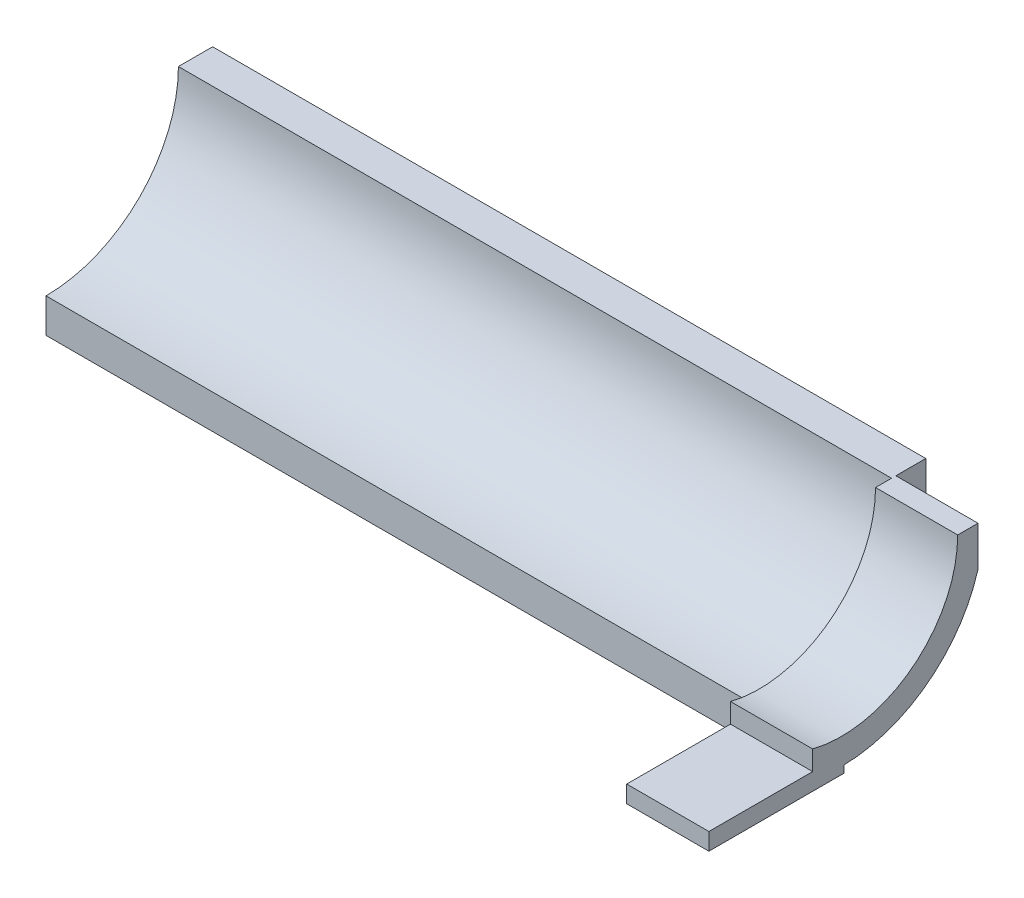
ISO-10303-21;
HEADER;
FILE_DESCRIPTION(('STEP AP214'),'2;1');
FILE_NAME('part.step','',(''),(''),'','','');
FILE_SCHEMA(('AUTOMOTIVE_DESIGN { 1 0 10303 214 1 1 1 1 }'));
ENDSEC;
DATA;
#1=APPLICATION_CONTEXT('core data for automotive mechanical design processes');
#2=APPLICATION_PROTOCOL_DEFINITION('international standard','automotive_design',2000,#1);
#3=PRODUCT_CONTEXT('',#1,'mechanical');
#4=PRODUCT('Part','Part','',(#3));
#5=PRODUCT_RELATED_PRODUCT_CATEGORY('part','',(#4));
#6=PRODUCT_DEFINITION_FORMATION('','',#4);
#7=PRODUCT_DEFINITION_CONTEXT('part definition',#1,'design');
#8=PRODUCT_DEFINITION('design','',#6,#7);
#9=PRODUCT_DEFINITION_SHAPE('','',#8);
#10=(LENGTH_UNIT() NAMED_UNIT(*) SI_UNIT(.MILLI.,.METRE.));
#11=(NAMED_UNIT(*) PLANE_ANGLE_UNIT() SI_UNIT($,.RADIAN.));
#12=(NAMED_UNIT(*) SI_UNIT($,.STERADIAN.) SOLID_ANGLE_UNIT());
#13=UNCERTAINTY_MEASURE_WITH_UNIT(LENGTH_MEASURE(1.E-05),#10,'distance_accuracy_value','');
#14=(GEOMETRIC_REPRESENTATION_CONTEXT(3) GLOBAL_UNCERTAINTY_ASSIGNED_CONTEXT((#13)) GLOBAL_UNIT_ASSIGNED_CONTEXT((#10,
#11,#12)) REPRESENTATION_CONTEXT('',''));
#15=CARTESIAN_POINT('',(0.,0.,0.));
#16=DIRECTION('',(0.,0.,1.));
#17=DIRECTION('',(1.,0.,0.));
#18=AXIS2_PLACEMENT_3D('',#15,#16,#17);
#19=CARTESIAN_POINT('',(66.1416,10.3365691560055,-21.9265015545331));
#20=DIRECTION('',(1.,0.,0.));
#21=DIRECTION('',(0.,0.,-1.));
#22=AXIS2_PLACEMENT_3D('',#19,#20,#21);
#23=PLANE('',#22);
#24=DIRECTION('',(0.,1.,0.));
#25=VECTOR('',#24,1.);
#26=CARTESIAN_POINT('',(66.1416,-3.53183084399447,-22.1989793496736));
#27=LINE('',#26,#25);
#28=CARTESIAN_POINT('',(66.1416,-3.53183084399447,-22.1989793496736));
#29=VERTEX_POINT('',#28);
#30=CARTESIAN_POINT('',(66.1416,-2.86861996990839,-22.1989793496736));
#31=VERTEX_POINT('',#30);
#32=EDGE_CURVE('E109',#29,#31,#27,.T.);
#33=ORIENTED_EDGE('',*,*,#32,.F.);
#34=DIRECTION('',(0.,0.,1.));
#35=VECTOR('',#34,1.);
#36=CARTESIAN_POINT('',(66.1416,-3.53183084399447,0.));
#37=LINE('',#36,#35);
#38=CARTESIAN_POINT('',(66.1416,-3.53183084399447,-21.9265015545331));
#39=VERTEX_POINT('',#38);
#40=EDGE_CURVE('E223',#29,#39,#37,.T.);
#41=ORIENTED_EDGE('',*,*,#40,.T.);
#42=DIRECTION('',(0.,-1.,0.));
#43=VECTOR('',#42,1.);
#44=CARTESIAN_POINT('',(66.1416,-5.11933084399447,-21.9265015545331));
#45=LINE('',#44,#43);
#46=CARTESIAN_POINT('',(66.1416,-5.11933084399447,-21.9265015545331));
#47=VERTEX_POINT('',#46);
#48=EDGE_CURVE('E279',#39,#47,#45,.T.);
#49=ORIENTED_EDGE('',*,*,#48,.T.);
#50=DIRECTION('',(0.,0.,-1.));
#51=VECTOR('',#50,1.);
#52=CARTESIAN_POINT('',(66.1416,-5.11933084399447,-37.3824015545331));
#53=LINE('',#52,#51);
#54=CARTESIAN_POINT('',(66.1416,-5.11933084399447,-37.3824015545331));
#55=VERTEX_POINT('',#54);
#56=EDGE_CURVE('E284',#47,#55,#53,.T.);
#57=ORIENTED_EDGE('',*,*,#56,.T.);
#58=DIRECTION('',(0.,1.,0.));
#59=VECTOR('',#58,1.);
#60=CARTESIAN_POINT('',(66.1416,10.3365691560055,-37.3824015545331));
#61=LINE('',#60,#59);
#62=CARTESIAN_POINT('',(66.1416,10.3365691560055,-37.3824015545331));
#63=VERTEX_POINT('',#62);
#64=EDGE_CURVE('E286',#55,#63,#61,.T.);
#65=ORIENTED_EDGE('',*,*,#64,.T.);
#66=DIRECTION('',(0.,0.,1.));
#67=VECTOR('',#66,1.);
#68=CARTESIAN_POINT('',(66.1416,10.3365691560055,-34.2074015545331));
#69=LINE('',#68,#67);
#70=CARTESIAN_POINT('',(66.1416,10.3365691560055,-34.6048765545184));
#71=VERTEX_POINT('',#70);
#72=EDGE_CURVE('E288',#63,#71,#69,.T.);
#73=ORIENTED_EDGE('',*,*,#72,.T.);
#74=DIRECTION('',(0.,-1.,0.));
#75=VECTOR('',#74,1.);
#76=CARTESIAN_POINT('',(66.1416,10.3365691560055,-34.6048765545184));
#77=LINE('',#76,#75);
#78=CARTESIAN_POINT('',(66.1416,6.63385780353041,-34.6048765545184));
#79=VERTEX_POINT('',#78);
#80=EDGE_CURVE('E262',#71,#79,#77,.T.);
#81=ORIENTED_EDGE('',*,*,#80,.T.);
#82=CARTESIAN_POINT('',(66.1416,10.3365691560055,-21.9265015545331));
#83=DIRECTION('',(1.,0.,0.));
#84=DIRECTION('',(0.,0.,-1.));
#85=AXIS2_PLACEMENT_3D('',#82,#83,#84);
#86=CIRCLE('',#85,13.208);
#87=EDGE_CURVE('E114',#31,#79,#86,.T.);
#88=ORIENTED_EDGE('',*,*,#87,.F.);
#89=EDGE_LOOP('',(#33,#41,#49,#57,#65,#73,#81,#88));
#90=FACE_BOUND('',#89,.T.);
#91=ADVANCED_FACE('F94',(#90),#23,.T.);
#92=CARTESIAN_POINT('',(66.1416,10.3365691560055,-21.9265015545331));
#93=DIRECTION('',(-1.,0.,0.));
#94=DIRECTION('',(0.,0.,1.));
#95=AXIS2_PLACEMENT_3D('',#92,#93,#94);
#96=CYLINDRICAL_SURFACE('',#95,12.2809);
#97=CARTESIAN_POINT('',(0.,10.3365691560055,-21.9265015545331));
#98=DIRECTION('',(-1.,0.,0.));
#99=DIRECTION('',(0.,0.,-1.));
#100=AXIS2_PLACEMENT_3D('',#97,#98,#99);
#101=CIRCLE('',#100,12.2809);
#102=CARTESIAN_POINT('',(0.,10.3365691560055,-34.2074015545331));
#103=VERTEX_POINT('',#102);
#104=CARTESIAN_POINT('',(0.,-1.94433084399446,-21.9265015545331));
#105=VERTEX_POINT('',#104);
#106=EDGE_CURVE('E206',#103,#105,#101,.T.);
#107=ORIENTED_EDGE('',*,*,#106,.T.);
#108=DIRECTION('',(-1.,0.,0.));
#109=VECTOR('',#108,1.);
#110=CARTESIAN_POINT('',(66.1416,-1.94433084399446,-21.9265015545331));
#111=LINE('',#110,#109);
#112=CARTESIAN_POINT('',(66.1416,-1.94433084399446,-21.9265015545331));
#113=VERTEX_POINT('',#112);
#114=EDGE_CURVE('E12',#113,#105,#111,.T.);
#115=ORIENTED_EDGE('',*,*,#114,.F.);
#116=CARTESIAN_POINT('',(66.1416,10.3365691560055,-21.9265015545331));
#117=DIRECTION('',(-1.,0.,0.));
#118=DIRECTION('',(0.,0.,-1.));
#119=AXIS2_PLACEMENT_3D('',#116,#117,#118);
#120=CIRCLE('',#119,12.2809);
#121=CARTESIAN_POINT('',(66.1416,10.3365691560055,-34.2074015545331));
#122=VERTEX_POINT('',#121);
#123=EDGE_CURVE('E276',#122,#113,#120,.T.);
#124=ORIENTED_EDGE('',*,*,#123,.F.);
#125=DIRECTION('',(-1.,0.,0.));
#126=VECTOR('',#125,1.);
#127=CARTESIAN_POINT('',(66.1416,10.3365691560055,-34.2074015545331));
#128=LINE('',#127,#126);
#129=EDGE_CURVE('E290',#122,#103,#128,.T.);
#130=ORIENTED_EDGE('',*,*,#129,.T.);
#131=EDGE_LOOP('',(#107,#115,#124,#130));
#132=FACE_BOUND('',#131,.T.);
#133=ADVANCED_FACE('F96',(#132),#96,.F.);
#134=CARTESIAN_POINT('',(66.1416,-5.11933084399447,-21.9265015545331));
#135=DIRECTION('',(0.,0.,-1.));
#136=DIRECTION('',(0.,1.,0.));
#137=AXIS2_PLACEMENT_3D('',#134,#135,#136);
#138=PLANE('',#137);
#139=DIRECTION('',(0.,-1.,0.));
#140=VECTOR('',#139,1.);
#141=CARTESIAN_POINT('',(0.,-5.11933084399447,-21.9265015545331));
#142=LINE('',#141,#140);
#143=CARTESIAN_POINT('',(0.,-5.11933084399447,-21.9265015545331));
#144=VERTEX_POINT('',#143);
#145=EDGE_CURVE('E293',#105,#144,#142,.T.);
#146=ORIENTED_EDGE('',*,*,#145,.T.);
#147=DIRECTION('',(-1.,0.,0.));
#148=VECTOR('',#147,1.);
#149=CARTESIAN_POINT('',(66.1416,-5.11933084399447,-21.9265015545331));
#150=LINE('',#149,#148);
#151=EDGE_CURVE('E102',#47,#144,#150,.T.);
#152=ORIENTED_EDGE('',*,*,#151,.F.);
#153=ORIENTED_EDGE('',*,*,#48,.F.);
#154=EDGE_CURVE('E281',#113,#39,#45,.T.);
#155=ORIENTED_EDGE('',*,*,#154,.F.);
#156=ORIENTED_EDGE('',*,*,#114,.T.);
#157=EDGE_LOOP('',(#146,#152,#153,#155,#156));
#158=FACE_BOUND('',#157,.T.);
#159=ADVANCED_FACE('F330',(#158),#138,.F.);
#160=CARTESIAN_POINT('',(66.1416,-5.11933084399447,-37.3824015545331));
#161=DIRECTION('',(0.,1.,0.));
#162=DIRECTION('',(0.,0.,1.));
#163=AXIS2_PLACEMENT_3D('',#160,#161,#162);
#164=PLANE('',#163);
#165=DIRECTION('',(0.,0.,-1.));
#166=VECTOR('',#165,1.);
#167=CARTESIAN_POINT('',(0.,-5.11933084399447,-37.3824015545331));
#168=LINE('',#167,#166);
#169=CARTESIAN_POINT('',(0.,-5.11933084399447,-37.3824015545331));
#170=VERTEX_POINT('',#169);
#171=EDGE_CURVE('E295',#144,#170,#168,.T.);
#172=ORIENTED_EDGE('',*,*,#171,.T.);
#173=DIRECTION('',(-1.,0.,0.));
#174=VECTOR('',#173,1.);
#175=CARTESIAN_POINT('',(66.1416,-5.11933084399447,-37.3824015545331));
#176=LINE('',#175,#174);
#177=EDGE_CURVE('E305',#55,#170,#176,.T.);
#178=ORIENTED_EDGE('',*,*,#177,.F.);
#179=ORIENTED_EDGE('',*,*,#56,.F.);
#180=ORIENTED_EDGE('',*,*,#151,.T.);
#181=EDGE_LOOP('',(#172,#178,#179,#180));
#182=FACE_BOUND('',#181,.T.);
#183=ADVANCED_FACE('F312',(#182),#164,.F.);
#184=CARTESIAN_POINT('',(66.1416,10.3365691560055,-37.3824015545331));
#185=DIRECTION('',(0.,0.,1.));
#186=DIRECTION('',(1.,0.,0.));
#187=AXIS2_PLACEMENT_3D('',#184,#185,#186);
#188=PLANE('',#187);
#189=DIRECTION('',(0.,1.,0.));
#190=VECTOR('',#189,1.);
#191=CARTESIAN_POINT('',(0.,10.3365691560055,-37.3824015545331));
#192=LINE('',#191,#190);
#193=CARTESIAN_POINT('',(0.,10.3365691560055,-37.3824015545331));
#194=VERTEX_POINT('',#193);
#195=EDGE_CURVE('E297',#170,#194,#192,.T.);
#196=ORIENTED_EDGE('',*,*,#195,.T.);
#197=DIRECTION('',(-1.,0.,0.));
#198=VECTOR('',#197,1.);
#199=CARTESIAN_POINT('',(66.1416,10.3365691560055,-37.3824015545331));
#200=LINE('',#199,#198);
#201=EDGE_CURVE('E302',#63,#194,#200,.T.);
#202=ORIENTED_EDGE('',*,*,#201,.F.);
#203=ORIENTED_EDGE('',*,*,#64,.F.);
#204=ORIENTED_EDGE('',*,*,#177,.T.);
#205=EDGE_LOOP('',(#196,#202,#203,#204));
#206=FACE_BOUND('',#205,.T.);
#207=ADVANCED_FACE('F323',(#206),#188,.F.);
#208=CARTESIAN_POINT('',(66.1416,10.3365691560055,-34.2074015545331));
#209=DIRECTION('',(0.,-1.,0.));
#210=DIRECTION('',(0.,0.,-1.));
#211=AXIS2_PLACEMENT_3D('',#208,#209,#210);
#212=PLANE('',#211);
#213=DIRECTION('',(0.,0.,1.));
#214=VECTOR('',#213,1.);
#215=CARTESIAN_POINT('',(0.,10.3365691560055,-34.2074015545331));
#216=LINE('',#215,#214);
#217=EDGE_CURVE('E280',#194,#103,#216,.T.);
#218=ORIENTED_EDGE('',*,*,#217,.T.);
#219=ORIENTED_EDGE('',*,*,#129,.F.);
#220=DIRECTION('',(0.,0.,-1.));
#221=VECTOR('',#220,1.);
#222=CARTESIAN_POINT('',(66.1416,10.3365691560055,0.));
#223=LINE('',#222,#221);
#224=CARTESIAN_POINT('',(66.1416,10.3365691560055,-32.7215015545331));
#225=VERTEX_POINT('',#224);
#226=EDGE_CURVE('E220',#225,#122,#223,.T.);
#227=ORIENTED_EDGE('',*,*,#226,.F.);
#228=DIRECTION('',(-1.,0.,0.));
#229=VECTOR('',#228,1.);
#230=CARTESIAN_POINT('',(73.7616,10.3365691560055,-32.7215015545331));
#231=LINE('',#230,#229);
#232=CARTESIAN_POINT('',(73.7616,10.3365691560055,-32.7215015545331));
#233=VERTEX_POINT('',#232);
#234=EDGE_CURVE('E234',#233,#225,#231,.T.);
#235=ORIENTED_EDGE('',*,*,#234,.F.);
#236=DIRECTION('',(0.,0.,-1.));
#237=VECTOR('',#236,1.);
#238=CARTESIAN_POINT('',(73.7616,10.3365691560055,0.));
#239=LINE('',#238,#237);
#240=CARTESIAN_POINT('',(73.7616,10.3365691560055,-34.6048765545184));
#241=VERTEX_POINT('',#240);
#242=EDGE_CURVE('E219',#233,#241,#239,.T.);
#243=ORIENTED_EDGE('',*,*,#242,.T.);
#244=DIRECTION('',(-1.,0.,0.));
#245=VECTOR('',#244,1.);
#246=CARTESIAN_POINT('',(73.7616,10.3365691560055,-34.6048765545184));
#247=LINE('',#246,#245);
#248=EDGE_CURVE('E261',#241,#71,#247,.T.);
#249=ORIENTED_EDGE('',*,*,#248,.T.);
#250=ORIENTED_EDGE('',*,*,#72,.F.);
#251=ORIENTED_EDGE('',*,*,#201,.T.);
#252=EDGE_LOOP('',(#218,#219,#227,#235,#243,#249,#250,#251));
#253=FACE_BOUND('',#252,.T.);
#254=ADVANCED_FACE('F327',(#253),#212,.F.);
#255=CARTESIAN_POINT('',(0.,10.3365691560055,-21.9265015545331));
#256=DIRECTION('',(1.,0.,0.));
#257=DIRECTION('',(0.,0.,-1.));
#258=AXIS2_PLACEMENT_3D('',#255,#256,#257);
#259=PLANE('',#258);
#260=ORIENTED_EDGE('',*,*,#106,.F.);
#261=ORIENTED_EDGE('',*,*,#217,.F.);
#262=ORIENTED_EDGE('',*,*,#195,.F.);
#263=ORIENTED_EDGE('',*,*,#171,.F.);
#264=ORIENTED_EDGE('',*,*,#145,.F.);
#265=EDGE_LOOP('',(#260,#261,#262,#263,#264));
#266=FACE_BOUND('',#265,.T.);
#267=ADVANCED_FACE('F319',(#266),#259,.F.);
#268=CARTESIAN_POINT('',(66.1416,0.,0.));
#269=DIRECTION('',(1.,0.,0.));
#270=DIRECTION('',(0.,0.,-1.));
#271=AXIS2_PLACEMENT_3D('',#268,#269,#270);
#272=PLANE('',#271);
#273=ORIENTED_EDGE('',*,*,#226,.T.);
#274=ORIENTED_EDGE('',*,*,#123,.T.);
#275=ORIENTED_EDGE('',*,*,#154,.T.);
#276=CARTESIAN_POINT('',(66.1416,-3.53183084399447,-9.6464015545331));
#277=VERTEX_POINT('',#276);
#278=EDGE_CURVE('E245',#39,#277,#37,.T.);
#279=ORIENTED_EDGE('',*,*,#278,.T.);
#280=DIRECTION('',(0.,1.,0.));
#281=VECTOR('',#280,1.);
#282=CARTESIAN_POINT('',(66.1416,0.,-9.6464015545331));
#283=LINE('',#282,#281);
#284=CARTESIAN_POINT('',(66.1416,-1.94433084399447,-9.6464015545331));
#285=VERTEX_POINT('',#284);
#286=EDGE_CURVE('E242',#277,#285,#283,.T.);
#287=ORIENTED_EDGE('',*,*,#286,.T.);
#288=DIRECTION('',(0.,0.,1.));
#289=VECTOR('',#288,1.);
#290=CARTESIAN_POINT('',(66.1416,-1.94433084399447,0.));
#291=LINE('',#290,#289);
#292=CARTESIAN_POINT('',(66.1416,-1.94433084399447,-19.268287123951));
#293=VERTEX_POINT('',#292);
#294=EDGE_CURVE('E239',#293,#285,#291,.T.);
#295=ORIENTED_EDGE('',*,*,#294,.F.);
#296=DIRECTION('',(0.,-1.,0.));
#297=VECTOR('',#296,1.);
#298=CARTESIAN_POINT('',(66.1416,0.,-19.268287123951));
#299=LINE('',#298,#297);
#300=CARTESIAN_POINT('',(66.1416,-0.126027129861796,-19.268287123951));
#301=VERTEX_POINT('',#300);
#302=EDGE_CURVE('E236',#301,#293,#299,.T.);
#303=ORIENTED_EDGE('',*,*,#302,.F.);
#304=CARTESIAN_POINT('',(66.1416,10.3365691560055,-21.9265015545331));
#305=DIRECTION('',(1.,0.,0.));
#306=DIRECTION('',(0.,0.,-1.));
#307=AXIS2_PLACEMENT_3D('',#304,#305,#306);
#308=CIRCLE('',#307,10.795);
#309=EDGE_CURVE('E203',#301,#225,#308,.T.);
#310=ORIENTED_EDGE('',*,*,#309,.T.);
#311=EDGE_LOOP('',(#273,#274,#275,#279,#287,#295,#303,#310));
#312=FACE_BOUND('',#311,.T.);
#313=ADVANCED_FACE('F334',(#312),#272,.F.);
#314=CARTESIAN_POINT('',(73.7616,-3.53183084399447,0.));
#315=DIRECTION('',(0.,-1.,0.));
#316=DIRECTION('',(0.,0.,-1.));
#317=AXIS2_PLACEMENT_3D('',#314,#315,#316);
#318=PLANE('',#317);
#319=ORIENTED_EDGE('',*,*,#40,.F.);
#320=DIRECTION('',(-1.,0.,0.));
#321=VECTOR('',#320,1.);
#322=CARTESIAN_POINT('',(73.7616,-3.53183084399447,-22.1989793496736));
#323=LINE('',#322,#321);
#324=CARTESIAN_POINT('',(73.7616,-3.53183084399447,-22.1989793496736));
#325=VERTEX_POINT('',#324);
#326=EDGE_CURVE('E237',#325,#29,#323,.T.);
#327=ORIENTED_EDGE('',*,*,#326,.F.);
#328=DIRECTION('',(0.,0.,1.));
#329=VECTOR('',#328,1.);
#330=CARTESIAN_POINT('',(73.7616,-3.53183084399447,0.));
#331=LINE('',#330,#329);
#332=CARTESIAN_POINT('',(73.7616,-3.53183084399447,-9.6464015545331));
#333=VERTEX_POINT('',#332);
#334=EDGE_CURVE('E230',#325,#333,#331,.T.);
#335=ORIENTED_EDGE('',*,*,#334,.T.);
#336=DIRECTION('',(-1.,0.,0.));
#337=VECTOR('',#336,1.);
#338=CARTESIAN_POINT('',(73.7616,-3.53183084399447,-9.6464015545331));
#339=LINE('',#338,#337);
#340=EDGE_CURVE('E248',#333,#277,#339,.T.);
#341=ORIENTED_EDGE('',*,*,#340,.T.);
#342=ORIENTED_EDGE('',*,*,#278,.F.);
#343=EDGE_LOOP('',(#319,#327,#335,#341,#342));
#344=FACE_BOUND('',#343,.T.);
#345=ADVANCED_FACE('F337',(#344),#318,.T.);
#346=CARTESIAN_POINT('',(73.7616,0.,-9.6464015545331));
#347=DIRECTION('',(0.,0.,1.));
#348=DIRECTION('',(1.,0.,0.));
#349=AXIS2_PLACEMENT_3D('',#346,#347,#348);
#350=PLANE('',#349);
#351=ORIENTED_EDGE('',*,*,#286,.F.);
#352=ORIENTED_EDGE('',*,*,#340,.F.);
#353=DIRECTION('',(0.,1.,0.));
#354=VECTOR('',#353,1.);
#355=CARTESIAN_POINT('',(73.7616,0.,-9.6464015545331));
#356=LINE('',#355,#354);
#357=CARTESIAN_POINT('',(73.7616,-1.94433084399447,-9.6464015545331));
#358=VERTEX_POINT('',#357);
#359=EDGE_CURVE('E227',#333,#358,#356,.T.);
#360=ORIENTED_EDGE('',*,*,#359,.T.);
#361=DIRECTION('',(-1.,0.,0.));
#362=VECTOR('',#361,1.);
#363=CARTESIAN_POINT('',(73.7616,-1.94433084399447,-9.6464015545331));
#364=LINE('',#363,#362);
#365=EDGE_CURVE('E251',#358,#285,#364,.T.);
#366=ORIENTED_EDGE('',*,*,#365,.T.);
#367=EDGE_LOOP('',(#351,#352,#360,#366));
#368=FACE_BOUND('',#367,.T.);
#369=ADVANCED_FACE('F342',(#368),#350,.T.);
#370=CARTESIAN_POINT('',(73.7616,-1.94433084399447,0.));
#371=DIRECTION('',(0.,-1.,0.));
#372=DIRECTION('',(0.,0.,-1.));
#373=AXIS2_PLACEMENT_3D('',#370,#371,#372);
#374=PLANE('',#373);
#375=ORIENTED_EDGE('',*,*,#294,.T.);
#376=ORIENTED_EDGE('',*,*,#365,.F.);
#377=DIRECTION('',(0.,0.,1.));
#378=VECTOR('',#377,1.);
#379=CARTESIAN_POINT('',(73.7616,-1.94433084399447,0.));
#380=LINE('',#379,#378);
#381=CARTESIAN_POINT('',(73.7616,-1.94433084399447,-19.268287123951));
#382=VERTEX_POINT('',#381);
#383=EDGE_CURVE('E215',#382,#358,#380,.T.);
#384=ORIENTED_EDGE('',*,*,#383,.F.);
#385=DIRECTION('',(-1.,0.,0.));
#386=VECTOR('',#385,1.);
#387=CARTESIAN_POINT('',(73.7616,-1.94433084399447,-19.268287123951));
#388=LINE('',#387,#386);
#389=EDGE_CURVE('E207',#382,#293,#388,.T.);
#390=ORIENTED_EDGE('',*,*,#389,.T.);
#391=EDGE_LOOP('',(#375,#376,#384,#390));
#392=FACE_BOUND('',#391,.T.);
#393=ADVANCED_FACE('F346',(#392),#374,.F.);
#394=CARTESIAN_POINT('',(73.7616,0.,-19.268287123951));
#395=DIRECTION('',(0.,0.,-1.));
#396=DIRECTION('',(-1.,0.,0.));
#397=AXIS2_PLACEMENT_3D('',#394,#395,#396);
#398=PLANE('',#397);
#399=ORIENTED_EDGE('',*,*,#302,.T.);
#400=ORIENTED_EDGE('',*,*,#389,.F.);
#401=DIRECTION('',(0.,-1.,0.));
#402=VECTOR('',#401,1.);
#403=CARTESIAN_POINT('',(73.7616,0.,-19.268287123951));
#404=LINE('',#403,#402);
#405=CARTESIAN_POINT('',(73.7616,-0.126027129861796,-19.268287123951));
#406=VERTEX_POINT('',#405);
#407=EDGE_CURVE('E210',#406,#382,#404,.T.);
#408=ORIENTED_EDGE('',*,*,#407,.F.);
#409=DIRECTION('',(-1.,0.,0.));
#410=VECTOR('',#409,1.);
#411=CARTESIAN_POINT('',(73.7616,-0.126027129861796,-19.268287123951));
#412=LINE('',#411,#410);
#413=EDGE_CURVE('E196',#406,#301,#412,.T.);
#414=ORIENTED_EDGE('',*,*,#413,.T.);
#415=EDGE_LOOP('',(#399,#400,#408,#414));
#416=FACE_BOUND('',#415,.T.);
#417=ADVANCED_FACE('F211',(#416),#398,.F.);
#418=CARTESIAN_POINT('',(73.7616,10.3365691560055,-21.9265015545331));
#419=DIRECTION('',(-1.,0.,0.));
#420=DIRECTION('',(0.,0.,1.));
#421=AXIS2_PLACEMENT_3D('',#418,#419,#420);
#422=CYLINDRICAL_SURFACE('',#421,10.795);
#423=ORIENTED_EDGE('',*,*,#309,.F.);
#424=ORIENTED_EDGE('',*,*,#413,.F.);
#425=CARTESIAN_POINT('',(73.7616,10.3365691560055,-21.9265015545331));
#426=DIRECTION('',(1.,0.,0.));
#427=DIRECTION('',(0.,0.,-1.));
#428=AXIS2_PLACEMENT_3D('',#425,#426,#427);
#429=CIRCLE('',#428,10.795);
#430=EDGE_CURVE('E200',#406,#233,#429,.T.);
#431=ORIENTED_EDGE('',*,*,#430,.T.);
#432=ORIENTED_EDGE('',*,*,#234,.T.);
#433=EDGE_LOOP('',(#423,#424,#431,#432));
#434=FACE_BOUND('',#433,.T.);
#435=ADVANCED_FACE('F198',(#434),#422,.F.);
#436=CARTESIAN_POINT('',(73.7616,0.,0.));
#437=DIRECTION('',(1.,0.,0.));
#438=DIRECTION('',(0.,0.,-1.));
#439=AXIS2_PLACEMENT_3D('',#436,#437,#438);
#440=PLANE('',#439);
#441=ORIENTED_EDGE('',*,*,#334,.F.);
#442=DIRECTION('',(0.,1.,0.));
#443=VECTOR('',#442,1.);
#444=CARTESIAN_POINT('',(73.7616,-3.53183084399447,-22.1989793496736));
#445=LINE('',#444,#443);
#446=CARTESIAN_POINT('',(73.7616,-2.86861996990839,-22.1989793496736));
#447=VERTEX_POINT('',#446);
#448=EDGE_CURVE('E259',#325,#447,#445,.T.);
#449=ORIENTED_EDGE('',*,*,#448,.T.);
#450=CARTESIAN_POINT('',(73.7616,10.3365691560055,-21.9265015545331));
#451=DIRECTION('',(1.,0.,0.));
#452=DIRECTION('',(0.,0.,-1.));
#453=AXIS2_PLACEMENT_3D('',#450,#451,#452);
#454=CIRCLE('',#453,13.208);
#455=CARTESIAN_POINT('',(73.7616,6.63385780353041,-34.6048765545184));
#456=VERTEX_POINT('',#455);
#457=EDGE_CURVE('E257',#447,#456,#454,.T.);
#458=ORIENTED_EDGE('',*,*,#457,.T.);
#459=DIRECTION('',(0.,-1.,0.));
#460=VECTOR('',#459,1.);
#461=CARTESIAN_POINT('',(73.7616,10.3365691560055,-34.6048765545184));
#462=LINE('',#461,#460);
#463=EDGE_CURVE('E254',#241,#456,#462,.T.);
#464=ORIENTED_EDGE('',*,*,#463,.F.);
#465=ORIENTED_EDGE('',*,*,#242,.F.);
#466=ORIENTED_EDGE('',*,*,#430,.F.);
#467=ORIENTED_EDGE('',*,*,#407,.T.);
#468=ORIENTED_EDGE('',*,*,#383,.T.);
#469=ORIENTED_EDGE('',*,*,#359,.F.);
#470=EDGE_LOOP('',(#441,#449,#458,#464,#465,#466,#467,#468,#469));
#471=FACE_BOUND('',#470,.T.);
#472=ADVANCED_FACE('F217',(#471),#440,.T.);
#473=CARTESIAN_POINT('',(73.7616,-3.53183084399447,-22.1989793496736));
#474=DIRECTION('',(0.,0.,1.));
#475=DIRECTION('',(1.,0.,0.));
#476=AXIS2_PLACEMENT_3D('',#473,#474,#475);
#477=PLANE('',#476);
#478=ORIENTED_EDGE('',*,*,#32,.T.);
#479=DIRECTION('',(-1.,0.,0.));
#480=VECTOR('',#479,1.);
#481=CARTESIAN_POINT('',(73.7616,-2.86861996990839,-22.1989793496736));
#482=LINE('',#481,#480);
#483=EDGE_CURVE('E268',#447,#31,#482,.T.);
#484=ORIENTED_EDGE('',*,*,#483,.F.);
#485=ORIENTED_EDGE('',*,*,#448,.F.);
#486=ORIENTED_EDGE('',*,*,#326,.T.);
#487=EDGE_LOOP('',(#478,#484,#485,#486));
#488=FACE_BOUND('',#487,.T.);
#489=ADVANCED_FACE('F350',(#488),#477,.F.);
#490=CARTESIAN_POINT('',(73.7616,10.3365691560055,-21.9265015545331));
#491=DIRECTION('',(-1.,0.,0.));
#492=DIRECTION('',(0.,0.,1.));
#493=AXIS2_PLACEMENT_3D('',#490,#491,#492);
#494=CYLINDRICAL_SURFACE('',#493,13.208);
#495=ORIENTED_EDGE('',*,*,#87,.T.);
#496=DIRECTION('',(-1.,0.,0.));
#497=VECTOR('',#496,1.);
#498=CARTESIAN_POINT('',(73.7616,6.63385780353041,-34.6048765545184));
#499=LINE('',#498,#497);
#500=EDGE_CURVE('E271',#456,#79,#499,.T.);
#501=ORIENTED_EDGE('',*,*,#500,.F.);
#502=ORIENTED_EDGE('',*,*,#457,.F.);
#503=ORIENTED_EDGE('',*,*,#483,.T.);
#504=EDGE_LOOP('',(#495,#501,#502,#503));
#505=FACE_BOUND('',#504,.T.);
#506=ADVANCED_FACE('F354',(#505),#494,.T.);
#507=CARTESIAN_POINT('',(73.7616,10.3365691560055,-34.6048765545184));
#508=DIRECTION('',(0.,0.,-1.));
#509=DIRECTION('',(-1.,0.,0.));
#510=AXIS2_PLACEMENT_3D('',#507,#508,#509);
#511=PLANE('',#510);
#512=ORIENTED_EDGE('',*,*,#80,.F.);
#513=ORIENTED_EDGE('',*,*,#248,.F.);
#514=ORIENTED_EDGE('',*,*,#463,.T.);
#515=ORIENTED_EDGE('',*,*,#500,.T.);
#516=EDGE_LOOP('',(#512,#513,#514,#515));
#517=FACE_BOUND('',#516,.T.);
#518=ADVANCED_FACE('F356',(#517),#511,.T.);
#519=CLOSED_SHELL('',(#91,#133,#159,#183,#207,#254,#267,#313,#345,#369,#393,#417,#435,#472,#489,
#506,#518));
#520=MANIFOLD_SOLID_BREP('B2',#519);
#521=ADVANCED_BREP_SHAPE_REPRESENTATION('',(#18,#520),#14);
#522=SHAPE_DEFINITION_REPRESENTATION(#9,#521);
ENDSEC;
END-ISO-10303-21;
